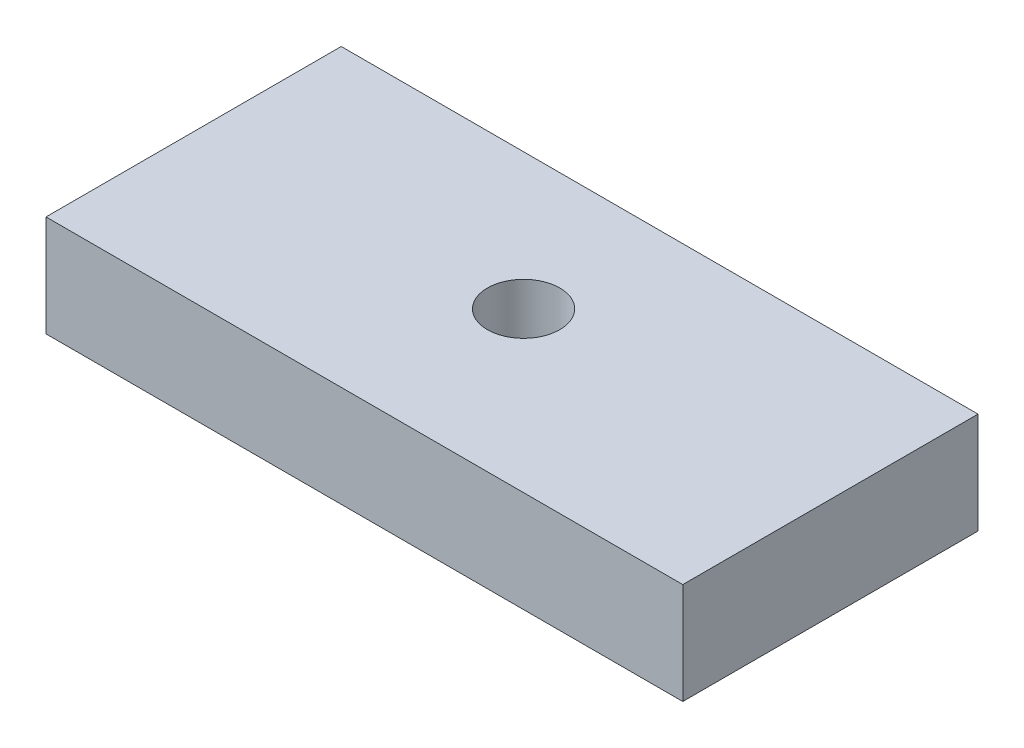
ISO-10303-21;
HEADER;
FILE_DESCRIPTION(('STEP AP214'),'2;1');
FILE_NAME('part.step','',(''),(''),'','','');
FILE_SCHEMA(('AUTOMOTIVE_DESIGN { 1 0 10303 214 1 1 1 1 }'));
ENDSEC;
DATA;
#1=APPLICATION_CONTEXT('core data for automotive mechanical design processes');
#2=APPLICATION_PROTOCOL_DEFINITION('international standard','automotive_design',2000,#1);
#3=PRODUCT_CONTEXT('',#1,'mechanical');
#4=PRODUCT('Part','Part','',(#3));
#5=PRODUCT_RELATED_PRODUCT_CATEGORY('part','',(#4));
#6=PRODUCT_DEFINITION_FORMATION('','',#4);
#7=PRODUCT_DEFINITION_CONTEXT('part definition',#1,'design');
#8=PRODUCT_DEFINITION('design','',#6,#7);
#9=PRODUCT_DEFINITION_SHAPE('','',#8);
#10=(LENGTH_UNIT() NAMED_UNIT(*) SI_UNIT(.MILLI.,.METRE.));
#11=(NAMED_UNIT(*) PLANE_ANGLE_UNIT() SI_UNIT($,.RADIAN.));
#12=(NAMED_UNIT(*) SI_UNIT($,.STERADIAN.) SOLID_ANGLE_UNIT());
#13=UNCERTAINTY_MEASURE_WITH_UNIT(LENGTH_MEASURE(1.E-05),#10,'distance_accuracy_value','');
#14=(GEOMETRIC_REPRESENTATION_CONTEXT(3) GLOBAL_UNCERTAINTY_ASSIGNED_CONTEXT((#13)) GLOBAL_UNIT_ASSIGNED_CONTEXT((#10,
#11,#12)) REPRESENTATION_CONTEXT('',''));
#15=CARTESIAN_POINT('',(0.,0.,0.));
#16=DIRECTION('',(0.,0.,1.));
#17=DIRECTION('',(1.,0.,0.));
#18=AXIS2_PLACEMENT_3D('',#15,#16,#17);
#19=CARTESIAN_POINT('',(-129.87609102877,-539.502297752568,-862.98614798632));
#20=DIRECTION('',(0.,1.,0.));
#21=DIRECTION('',(0.,0.,1.));
#22=AXIS2_PLACEMENT_3D('',#19,#20,#21);
#23=PLANE('',#22);
#24=CARTESIAN_POINT('',(-196.682719320126,-539.502297752568,-870.48614798632));
#25=DIRECTION('',(0.,-1.,0.));
#26=DIRECTION('',(0.,0.,-1.));
#27=AXIS2_PLACEMENT_3D('',#24,#25,#26);
#28=CIRCLE('',#27,12.5);
#29=CARTESIAN_POINT('',(-196.682719320126,-539.502297752568,-882.98614798632));
#30=VERTEX_POINT('',#29);
#31=EDGE_CURVE('E20',#30,#30,#28,.T.);
#32=ORIENTED_EDGE('',*,*,#31,.T.);
#33=EDGE_LOOP('',(#32));
#34=FACE_BOUND('',#33,.T.);
#35=DIRECTION('',(0.,0.,1.));
#36=VECTOR('',#35,1.);
#37=CARTESIAN_POINT('',(-306.682719320127,-539.502297752568,-862.98614798632));
#38=LINE('',#37,#36);
#39=CARTESIAN_POINT('',(-306.682719320127,-539.502297752568,-815.486147986319));
#40=VERTEX_POINT('',#39);
#41=CARTESIAN_POINT('',(-306.682719320127,-539.502297752568,-917.48614798632));
#42=VERTEX_POINT('',#41);
#43=EDGE_CURVE('E60',#40,#42,#38,.F.);
#44=ORIENTED_EDGE('',*,*,#43,.F.);
#45=DIRECTION('',(1.,0.,0.));
#46=VECTOR('',#45,1.);
#47=CARTESIAN_POINT('',(-129.87609102877,-539.502297752568,-815.486147986319));
#48=LINE('',#47,#46);
#49=CARTESIAN_POINT('',(-86.6827193201257,-539.502297752568,-815.486147986319));
#50=VERTEX_POINT('',#49);
#51=EDGE_CURVE('E92',#50,#40,#48,.F.);
#52=ORIENTED_EDGE('',*,*,#51,.F.);
#53=DIRECTION('',(0.,0.,-1.));
#54=VECTOR('',#53,1.);
#55=CARTESIAN_POINT('',(-86.6827193201257,-539.502297752568,-862.98614798632));
#56=LINE('',#55,#54);
#57=CARTESIAN_POINT('',(-86.6827193201257,-539.502297752568,-917.48614798632));
#58=VERTEX_POINT('',#57);
#59=EDGE_CURVE('E62',#58,#50,#56,.F.);
#60=ORIENTED_EDGE('',*,*,#59,.F.);
#61=DIRECTION('',(1.,0.,0.));
#62=VECTOR('',#61,1.);
#63=CARTESIAN_POINT('',(-129.87609102877,-539.502297752568,-917.48614798632));
#64=LINE('',#63,#62);
#65=EDGE_CURVE('E55',#58,#42,#64,.F.);
#66=ORIENTED_EDGE('',*,*,#65,.T.);
#67=EDGE_LOOP('',(#44,#52,#60,#66));
#68=FACE_BOUND('',#67,.T.);
#69=ADVANCED_FACE('F17',(#34,#68),#23,.T.);
#70=CARTESIAN_POINT('',(-306.682719320127,-557.002297752567,-862.98614798632));
#71=DIRECTION('',(-1.,0.,0.));
#72=DIRECTION('',(0.,0.,1.));
#73=AXIS2_PLACEMENT_3D('',#70,#71,#72);
#74=PLANE('',#73);
#75=DIRECTION('',(0.,0.,-1.));
#76=VECTOR('',#75,1.);
#77=CARTESIAN_POINT('',(-306.682719320127,-574.502297752568,-862.98614798632));
#78=LINE('',#77,#76);
#79=CARTESIAN_POINT('',(-306.682719320127,-574.502297752568,-815.486147986319));
#80=VERTEX_POINT('',#79);
#81=CARTESIAN_POINT('',(-306.682719320127,-574.502297752568,-917.48614798632));
#82=VERTEX_POINT('',#81);
#83=EDGE_CURVE('E95',#80,#82,#78,.T.);
#84=ORIENTED_EDGE('',*,*,#83,.F.);
#85=DIRECTION('',(0.,1.,0.));
#86=VECTOR('',#85,1.);
#87=CARTESIAN_POINT('',(-306.682719320127,-557.002297752567,-815.486147986319));
#88=LINE('',#87,#86);
#89=EDGE_CURVE('E71',#40,#80,#88,.F.);
#90=ORIENTED_EDGE('',*,*,#89,.F.);
#91=ORIENTED_EDGE('',*,*,#43,.T.);
#92=DIRECTION('',(0.,1.,0.));
#93=VECTOR('',#92,1.);
#94=CARTESIAN_POINT('',(-306.682719320127,-557.002297752567,-917.48614798632));
#95=LINE('',#94,#93);
#96=EDGE_CURVE('E65',#42,#82,#95,.F.);
#97=ORIENTED_EDGE('',*,*,#96,.T.);
#98=EDGE_LOOP('',(#84,#90,#91,#97));
#99=FACE_BOUND('',#98,.T.);
#100=ADVANCED_FACE('F68',(#99),#74,.T.);
#101=CARTESIAN_POINT('',(-129.87609102877,-557.002297752567,-917.48614798632));
#102=DIRECTION('',(0.,0.,1.));
#103=DIRECTION('',(1.,0.,0.));
#104=AXIS2_PLACEMENT_3D('',#101,#102,#103);
#105=PLANE('',#104);
#106=ORIENTED_EDGE('',*,*,#65,.F.);
#107=DIRECTION('',(0.,1.,0.));
#108=VECTOR('',#107,1.);
#109=CARTESIAN_POINT('',(-86.6827193201257,-557.002297752567,-917.48614798632));
#110=LINE('',#109,#108);
#111=CARTESIAN_POINT('',(-86.6827193201257,-574.502297752568,-917.48614798632));
#112=VERTEX_POINT('',#111);
#113=EDGE_CURVE('E80',#112,#58,#110,.T.);
#114=ORIENTED_EDGE('',*,*,#113,.F.);
#115=DIRECTION('',(1.,0.,0.));
#116=VECTOR('',#115,1.);
#117=CARTESIAN_POINT('',(-129.87609102877,-574.502297752568,-917.48614798632));
#118=LINE('',#117,#116);
#119=EDGE_CURVE('E77',#82,#112,#118,.T.);
#120=ORIENTED_EDGE('',*,*,#119,.F.);
#121=ORIENTED_EDGE('',*,*,#96,.F.);
#122=EDGE_LOOP('',(#106,#114,#120,#121));
#123=FACE_BOUND('',#122,.T.);
#124=ADVANCED_FACE('F75',(#123),#105,.F.);
#125=CARTESIAN_POINT('',(-86.6827193201257,-557.002297752567,-862.98614798632));
#126=DIRECTION('',(1.,0.,0.));
#127=DIRECTION('',(0.,0.,-1.));
#128=AXIS2_PLACEMENT_3D('',#125,#126,#127);
#129=PLANE('',#128);
#130=ORIENTED_EDGE('',*,*,#59,.T.);
#131=DIRECTION('',(0.,1.,0.));
#132=VECTOR('',#131,1.);
#133=CARTESIAN_POINT('',(-86.6827193201257,-557.002297752567,-815.486147986319));
#134=LINE('',#133,#132);
#135=CARTESIAN_POINT('',(-86.6827193201257,-574.502297752568,-815.486147986319));
#136=VERTEX_POINT('',#135);
#137=EDGE_CURVE('E35',#136,#50,#134,.T.);
#138=ORIENTED_EDGE('',*,*,#137,.F.);
#139=DIRECTION('',(0.,0.,-1.));
#140=VECTOR('',#139,1.);
#141=CARTESIAN_POINT('',(-86.6827193201257,-574.502297752568,-862.98614798632));
#142=LINE('',#141,#140);
#143=EDGE_CURVE('E100',#112,#136,#142,.F.);
#144=ORIENTED_EDGE('',*,*,#143,.F.);
#145=ORIENTED_EDGE('',*,*,#113,.T.);
#146=EDGE_LOOP('',(#130,#138,#144,#145));
#147=FACE_BOUND('',#146,.T.);
#148=ADVANCED_FACE('F112',(#147),#129,.T.);
#149=CARTESIAN_POINT('',(-129.87609102877,-557.002297752567,-815.486147986319));
#150=DIRECTION('',(0.,0.,1.));
#151=DIRECTION('',(1.,0.,0.));
#152=AXIS2_PLACEMENT_3D('',#149,#150,#151);
#153=PLANE('',#152);
#154=ORIENTED_EDGE('',*,*,#137,.T.);
#155=ORIENTED_EDGE('',*,*,#51,.T.);
#156=ORIENTED_EDGE('',*,*,#89,.T.);
#157=DIRECTION('',(1.,0.,0.));
#158=VECTOR('',#157,1.);
#159=CARTESIAN_POINT('',(-129.87609102877,-574.502297752568,-815.486147986319));
#160=LINE('',#159,#158);
#161=EDGE_CURVE('E27',#136,#80,#160,.F.);
#162=ORIENTED_EDGE('',*,*,#161,.F.);
#163=EDGE_LOOP('',(#154,#155,#156,#162));
#164=FACE_BOUND('',#163,.T.);
#165=ADVANCED_FACE('F109',(#164),#153,.T.);
#166=CARTESIAN_POINT('',(-196.682719320126,-574.502297752568,-870.48614798632));
#167=DIRECTION('',(0.,-1.,0.));
#168=DIRECTION('',(0.,0.,-1.));
#169=AXIS2_PLACEMENT_3D('',#166,#167,#168);
#170=CYLINDRICAL_SURFACE('',#169,12.5);
#171=CARTESIAN_POINT('',(-196.682719320126,-574.502297752568,-870.48614798632));
#172=DIRECTION('',(0.,-1.,0.));
#173=DIRECTION('',(0.,0.,-1.));
#174=AXIS2_PLACEMENT_3D('',#171,#172,#173);
#175=CIRCLE('',#174,12.5);
#176=CARTESIAN_POINT('',(-196.682719320126,-574.502297752568,-882.98614798632));
#177=VERTEX_POINT('',#176);
#178=EDGE_CURVE('E11',#177,#177,#175,.F.);
#179=ORIENTED_EDGE('',*,*,#178,.F.);
#180=EDGE_LOOP('',(#179));
#181=FACE_BOUND('',#180,.T.);
#182=ORIENTED_EDGE('',*,*,#31,.F.);
#183=EDGE_LOOP('',(#182));
#184=FACE_BOUND('',#183,.T.);
#185=ADVANCED_FACE('F111',(#181,#184),#170,.F.);
#186=CARTESIAN_POINT('',(-129.87609102877,-574.502297752568,-862.98614798632));
#187=DIRECTION('',(0.,-1.,0.));
#188=DIRECTION('',(0.,0.,-1.));
#189=AXIS2_PLACEMENT_3D('',#186,#187,#188);
#190=PLANE('',#189);
#191=ORIENTED_EDGE('',*,*,#178,.T.);
#192=EDGE_LOOP('',(#191));
#193=FACE_BOUND('',#192,.T.);
#194=ORIENTED_EDGE('',*,*,#143,.T.);
#195=ORIENTED_EDGE('',*,*,#161,.T.);
#196=ORIENTED_EDGE('',*,*,#83,.T.);
#197=ORIENTED_EDGE('',*,*,#119,.T.);
#198=EDGE_LOOP('',(#194,#195,#196,#197));
#199=FACE_BOUND('',#198,.T.);
#200=ADVANCED_FACE('F107',(#193,#199),#190,.T.);
#201=CLOSED_SHELL('',(#69,#100,#124,#148,#165,#185,#200));
#202=MANIFOLD_SOLID_BREP('B1',#201);
#203=ADVANCED_BREP_SHAPE_REPRESENTATION('',(#18,#202),#14);
#204=SHAPE_DEFINITION_REPRESENTATION(#9,#203);
ENDSEC;
END-ISO-10303-21;
